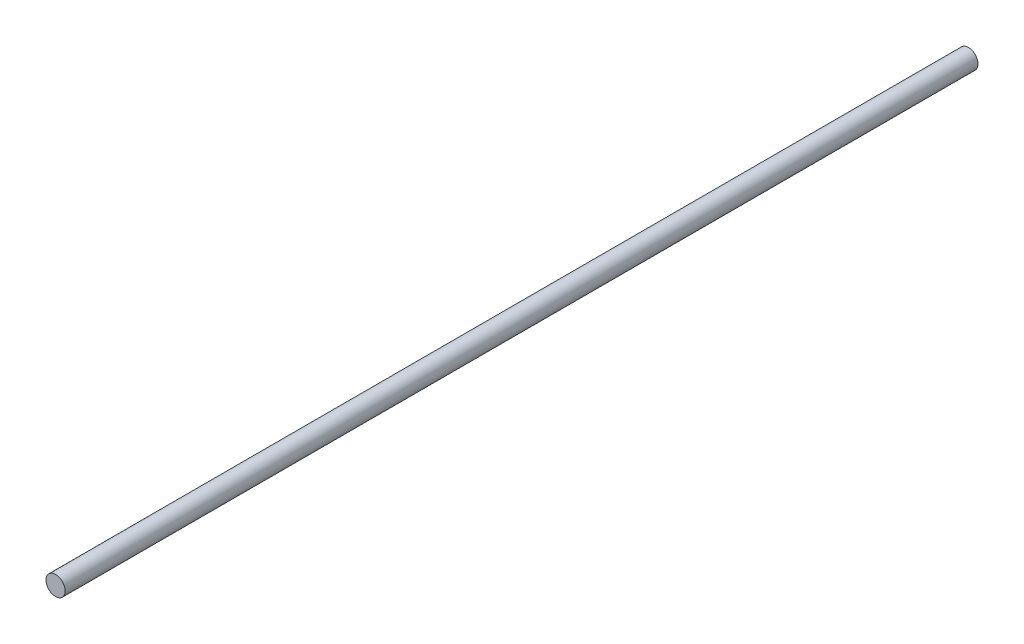
ISO-10303-21;
HEADER;
FILE_DESCRIPTION(('STEP AP214'),'2;1');
FILE_NAME('part.step','',(''),(''),'','','');
FILE_SCHEMA(('AUTOMOTIVE_DESIGN { 1 0 10303 214 1 1 1 1 }'));
ENDSEC;
DATA;
#1=APPLICATION_CONTEXT('core data for automotive mechanical design processes');
#2=APPLICATION_PROTOCOL_DEFINITION('international standard','automotive_design',2000,#1);
#3=PRODUCT_CONTEXT('',#1,'mechanical');
#4=PRODUCT('Part','Part','',(#3));
#5=PRODUCT_RELATED_PRODUCT_CATEGORY('part','',(#4));
#6=PRODUCT_DEFINITION_FORMATION('','',#4);
#7=PRODUCT_DEFINITION_CONTEXT('part definition',#1,'design');
#8=PRODUCT_DEFINITION('design','',#6,#7);
#9=PRODUCT_DEFINITION_SHAPE('','',#8);
#10=(LENGTH_UNIT() NAMED_UNIT(*) SI_UNIT(.MILLI.,.METRE.));
#11=(NAMED_UNIT(*) PLANE_ANGLE_UNIT() SI_UNIT($,.RADIAN.));
#12=(NAMED_UNIT(*) SI_UNIT($,.STERADIAN.) SOLID_ANGLE_UNIT());
#13=UNCERTAINTY_MEASURE_WITH_UNIT(LENGTH_MEASURE(1.E-05),#10,'distance_accuracy_value','');
#14=(GEOMETRIC_REPRESENTATION_CONTEXT(3) GLOBAL_UNCERTAINTY_ASSIGNED_CONTEXT((#13)) GLOBAL_UNIT_ASSIGNED_CONTEXT((#10,
#11,#12)) REPRESENTATION_CONTEXT('',''));
#15=CARTESIAN_POINT('',(0.,0.,0.));
#16=DIRECTION('',(0.,0.,1.));
#17=DIRECTION('',(1.,0.,0.));
#18=AXIS2_PLACEMENT_3D('',#15,#16,#17);
#19=CARTESIAN_POINT('',(-1.24032792372385,-1.13088722457174,300.));
#20=DIRECTION('',(0.,0.,-1.));
#21=DIRECTION('',(-1.,0.,0.));
#22=AXIS2_PLACEMENT_3D('',#19,#20,#21);
#23=CYLINDRICAL_SURFACE('',#22,3.15);
#24=CARTESIAN_POINT('',(-1.24032792372385,-1.13088722457174,300.));
#25=DIRECTION('',(0.,0.,1.));
#26=DIRECTION('',(1.,0.,0.));
#27=AXIS2_PLACEMENT_3D('',#24,#25,#26);
#28=CIRCLE('',#27,3.15);
#29=CARTESIAN_POINT('',(1.90967207627616,-1.13088722457174,300.));
#30=VERTEX_POINT('',#29);
#31=EDGE_CURVE('E10',#30,#30,#28,.T.);
#32=ORIENTED_EDGE('',*,*,#31,.F.);
#33=EDGE_LOOP('',(#32));
#34=FACE_BOUND('',#33,.T.);
#35=CARTESIAN_POINT('',(-1.24032792372385,-1.13088722457174,0.));
#36=DIRECTION('',(0.,0.,1.));
#37=DIRECTION('',(1.,0.,0.));
#38=AXIS2_PLACEMENT_3D('',#35,#36,#37);
#39=CIRCLE('',#38,3.15);
#40=CARTESIAN_POINT('',(1.90967207627616,-1.13088722457174,0.));
#41=VERTEX_POINT('',#40);
#42=EDGE_CURVE('E40',#41,#41,#39,.T.);
#43=ORIENTED_EDGE('',*,*,#42,.T.);
#44=EDGE_LOOP('',(#43));
#45=FACE_BOUND('',#44,.T.);
#46=ADVANCED_FACE('F37',(#34,#45),#23,.T.);
#47=CARTESIAN_POINT('',(-1.24032792372385,-1.13088722457174,300.));
#48=DIRECTION('',(0.,0.,1.));
#49=DIRECTION('',(1.,0.,0.));
#50=AXIS2_PLACEMENT_3D('',#47,#48,#49);
#51=PLANE('',#50);
#52=ORIENTED_EDGE('',*,*,#31,.T.);
#53=EDGE_LOOP('',(#52));
#54=FACE_BOUND('',#53,.T.);
#55=ADVANCED_FACE('F54',(#54),#51,.T.);
#56=CARTESIAN_POINT('',(-1.24032792372385,-1.13088722457174,0.));
#57=DIRECTION('',(0.,0.,1.));
#58=DIRECTION('',(1.,0.,0.));
#59=AXIS2_PLACEMENT_3D('',#56,#57,#58);
#60=PLANE('',#59);
#61=ORIENTED_EDGE('',*,*,#42,.F.);
#62=EDGE_LOOP('',(#61));
#63=FACE_BOUND('',#62,.T.);
#64=ADVANCED_FACE('F52',(#63),#60,.F.);
#65=CLOSED_SHELL('',(#46,#55,#64));
#66=MANIFOLD_SOLID_BREP('B2',#65);
#67=ADVANCED_BREP_SHAPE_REPRESENTATION('',(#18,#66),#14);
#68=SHAPE_DEFINITION_REPRESENTATION(#9,#67);
ENDSEC;
END-ISO-10303-21;
